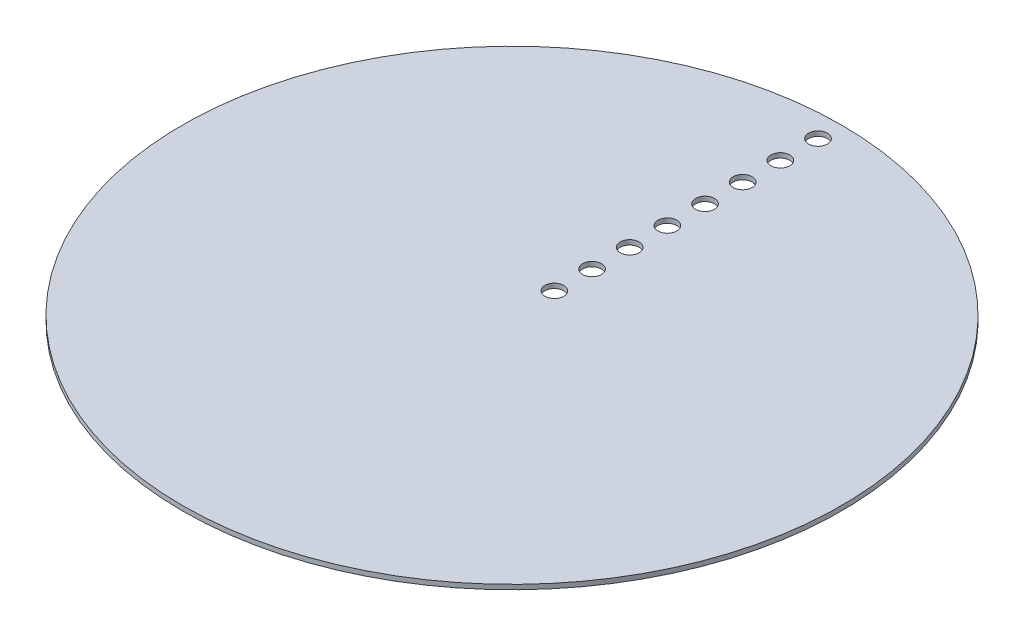
ISO-10303-21;
HEADER;
FILE_DESCRIPTION(('STEP AP214'),'2;1');
FILE_NAME('part.step','',(''),(''),'','','');
FILE_SCHEMA(('AUTOMOTIVE_DESIGN { 1 0 10303 214 1 1 1 1 }'));
ENDSEC;
DATA;
#1=APPLICATION_CONTEXT('core data for automotive mechanical design processes');
#2=APPLICATION_PROTOCOL_DEFINITION('international standard','automotive_design',2000,#1);
#3=PRODUCT_CONTEXT('',#1,'mechanical');
#4=PRODUCT('Part','Part','',(#3));
#5=PRODUCT_RELATED_PRODUCT_CATEGORY('part','',(#4));
#6=PRODUCT_DEFINITION_FORMATION('','',#4);
#7=PRODUCT_DEFINITION_CONTEXT('part definition',#1,'design');
#8=PRODUCT_DEFINITION('design','',#6,#7);
#9=PRODUCT_DEFINITION_SHAPE('','',#8);
#10=(LENGTH_UNIT() NAMED_UNIT(*) SI_UNIT(.MILLI.,.METRE.));
#11=(NAMED_UNIT(*) PLANE_ANGLE_UNIT() SI_UNIT($,.RADIAN.));
#12=(NAMED_UNIT(*) SI_UNIT($,.STERADIAN.) SOLID_ANGLE_UNIT());
#13=UNCERTAINTY_MEASURE_WITH_UNIT(LENGTH_MEASURE(1.E-05),#10,'distance_accuracy_value','');
#14=(GEOMETRIC_REPRESENTATION_CONTEXT(3) GLOBAL_UNCERTAINTY_ASSIGNED_CONTEXT((#13)) GLOBAL_UNIT_ASSIGNED_CONTEXT((#10,
#11,#12)) REPRESENTATION_CONTEXT('',''));
#15=CARTESIAN_POINT('',(0.,0.,0.));
#16=DIRECTION('',(0.,0.,1.));
#17=DIRECTION('',(1.,0.,0.));
#18=AXIS2_PLACEMENT_3D('',#15,#16,#17);
#19=CARTESIAN_POINT('',(0.,1.,0.));
#20=DIRECTION('',(0.,-1.,0.));
#21=DIRECTION('',(0.,0.,-1.));
#22=AXIS2_PLACEMENT_3D('',#19,#20,#21);
#23=CYLINDRICAL_SURFACE('',#22,70.);
#24=CARTESIAN_POINT('',(0.,1.,0.));
#25=DIRECTION('',(0.,1.,0.));
#26=DIRECTION('',(0.,0.,1.));
#27=AXIS2_PLACEMENT_3D('',#24,#25,#26);
#28=CIRCLE('',#27,70.);
#29=CARTESIAN_POINT('',(0.,1.,70.));
#30=VERTEX_POINT('',#29);
#31=EDGE_CURVE('E10',#30,#30,#28,.T.);
#32=ORIENTED_EDGE('',*,*,#31,.F.);
#33=EDGE_LOOP('',(#32));
#34=FACE_BOUND('',#33,.T.);
#35=CARTESIAN_POINT('',(0.,0.,0.));
#36=DIRECTION('',(0.,1.,0.));
#37=DIRECTION('',(0.,0.,1.));
#38=AXIS2_PLACEMENT_3D('',#35,#36,#37);
#39=CIRCLE('',#38,70.);
#40=CARTESIAN_POINT('',(0.,0.,70.));
#41=VERTEX_POINT('',#40);
#42=EDGE_CURVE('E44',#41,#41,#39,.T.);
#43=ORIENTED_EDGE('',*,*,#42,.T.);
#44=EDGE_LOOP('',(#43));
#45=FACE_BOUND('',#44,.T.);
#46=ADVANCED_FACE('F41',(#34,#45),#23,.T.);
#47=CARTESIAN_POINT('',(0.,1.,0.));
#48=DIRECTION('',(0.,1.,0.));
#49=DIRECTION('',(0.,0.,1.));
#50=AXIS2_PLACEMENT_3D('',#47,#48,#49);
#51=PLANE('',#50);
#52=CARTESIAN_POINT('',(0.,1.,-9.));
#53=DIRECTION('',(0.,1.,0.));
#54=DIRECTION('',(0.,0.,1.));
#55=AXIS2_PLACEMENT_3D('',#52,#53,#54);
#56=CIRCLE('',#55,2.);
#57=CARTESIAN_POINT('',(0.,1.,-7.));
#58=VERTEX_POINT('',#57);
#59=EDGE_CURVE('E95',#58,#58,#56,.T.);
#60=ORIENTED_EDGE('',*,*,#59,.F.);
#61=EDGE_LOOP('',(#60));
#62=FACE_BOUND('',#61,.T.);
#63=CARTESIAN_POINT('',(0.,1.,-17.));
#64=DIRECTION('',(0.,1.,0.));
#65=DIRECTION('',(0.,0.,1.));
#66=AXIS2_PLACEMENT_3D('',#63,#64,#65);
#67=CIRCLE('',#66,2.);
#68=CARTESIAN_POINT('',(0.,1.,-15.));
#69=VERTEX_POINT('',#68);
#70=EDGE_CURVE('E92',#69,#69,#67,.T.);
#71=ORIENTED_EDGE('',*,*,#70,.F.);
#72=EDGE_LOOP('',(#71));
#73=FACE_BOUND('',#72,.T.);
#74=CARTESIAN_POINT('',(0.,1.,-25.));
#75=DIRECTION('',(0.,1.,0.));
#76=DIRECTION('',(0.,0.,1.));
#77=AXIS2_PLACEMENT_3D('',#74,#75,#76);
#78=CIRCLE('',#77,2.);
#79=CARTESIAN_POINT('',(0.,1.,-23.));
#80=VERTEX_POINT('',#79);
#81=EDGE_CURVE('E86',#80,#80,#78,.T.);
#82=ORIENTED_EDGE('',*,*,#81,.F.);
#83=EDGE_LOOP('',(#82));
#84=FACE_BOUND('',#83,.T.);
#85=CARTESIAN_POINT('',(0.,1.,-33.));
#86=DIRECTION('',(0.,1.,0.));
#87=DIRECTION('',(0.,0.,1.));
#88=AXIS2_PLACEMENT_3D('',#85,#86,#87);
#89=CIRCLE('',#88,2.);
#90=CARTESIAN_POINT('',(0.,1.,-31.));
#91=VERTEX_POINT('',#90);
#92=EDGE_CURVE('E80',#91,#91,#89,.T.);
#93=ORIENTED_EDGE('',*,*,#92,.F.);
#94=EDGE_LOOP('',(#93));
#95=FACE_BOUND('',#94,.T.);
#96=CARTESIAN_POINT('',(0.,1.,-41.));
#97=DIRECTION('',(0.,1.,0.));
#98=DIRECTION('',(0.,0.,1.));
#99=AXIS2_PLACEMENT_3D('',#96,#97,#98);
#100=CIRCLE('',#99,2.);
#101=CARTESIAN_POINT('',(0.,1.,-39.));
#102=VERTEX_POINT('',#101);
#103=EDGE_CURVE('E74',#102,#102,#100,.T.);
#104=ORIENTED_EDGE('',*,*,#103,.F.);
#105=EDGE_LOOP('',(#104));
#106=FACE_BOUND('',#105,.T.);
#107=CARTESIAN_POINT('',(0.,1.,-49.));
#108=DIRECTION('',(0.,1.,0.));
#109=DIRECTION('',(0.,0.,1.));
#110=AXIS2_PLACEMENT_3D('',#107,#108,#109);
#111=CIRCLE('',#110,2.);
#112=CARTESIAN_POINT('',(0.,1.,-47.));
#113=VERTEX_POINT('',#112);
#114=EDGE_CURVE('E68',#113,#113,#111,.T.);
#115=ORIENTED_EDGE('',*,*,#114,.F.);
#116=EDGE_LOOP('',(#115));
#117=FACE_BOUND('',#116,.T.);
#118=CARTESIAN_POINT('',(0.,1.,-57.));
#119=DIRECTION('',(0.,1.,0.));
#120=DIRECTION('',(0.,0.,1.));
#121=AXIS2_PLACEMENT_3D('',#118,#119,#120);
#122=CIRCLE('',#121,2.);
#123=CARTESIAN_POINT('',(0.,1.,-55.));
#124=VERTEX_POINT('',#123);
#125=EDGE_CURVE('E62',#124,#124,#122,.T.);
#126=ORIENTED_EDGE('',*,*,#125,.F.);
#127=EDGE_LOOP('',(#126));
#128=FACE_BOUND('',#127,.T.);
#129=CARTESIAN_POINT('',(0.,1.,-65.));
#130=DIRECTION('',(0.,1.,0.));
#131=DIRECTION('',(0.,0.,1.));
#132=AXIS2_PLACEMENT_3D('',#129,#130,#131);
#133=CIRCLE('',#132,2.);
#134=CARTESIAN_POINT('',(0.,1.,-63.));
#135=VERTEX_POINT('',#134);
#136=EDGE_CURVE('E56',#135,#135,#133,.T.);
#137=ORIENTED_EDGE('',*,*,#136,.F.);
#138=EDGE_LOOP('',(#137));
#139=FACE_BOUND('',#138,.T.);
#140=ORIENTED_EDGE('',*,*,#31,.T.);
#141=EDGE_LOOP('',(#140));
#142=FACE_BOUND('',#141,.T.);
#143=ADVANCED_FACE('F111',(#62,#73,#84,#95,#106,#117,#128,#139,#142),#51,.T.);
#144=CARTESIAN_POINT('',(0.,0.,0.));
#145=DIRECTION('',(0.,1.,0.));
#146=DIRECTION('',(0.,0.,1.));
#147=AXIS2_PLACEMENT_3D('',#144,#145,#146);
#148=PLANE('',#147);
#149=CARTESIAN_POINT('',(0.,0.,-9.));
#150=DIRECTION('',(0.,1.,0.));
#151=DIRECTION('',(0.,0.,1.));
#152=AXIS2_PLACEMENT_3D('',#149,#150,#151);
#153=CIRCLE('',#152,2.);
#154=CARTESIAN_POINT('',(0.,0.,-7.));
#155=VERTEX_POINT('',#154);
#156=EDGE_CURVE('E51',#155,#155,#153,.T.);
#157=ORIENTED_EDGE('',*,*,#156,.T.);
#158=EDGE_LOOP('',(#157));
#159=FACE_BOUND('',#158,.T.);
#160=CARTESIAN_POINT('',(0.,0.,-17.));
#161=DIRECTION('',(0.,1.,0.));
#162=DIRECTION('',(0.,0.,1.));
#163=AXIS2_PLACEMENT_3D('',#160,#161,#162);
#164=CIRCLE('',#163,2.);
#165=CARTESIAN_POINT('',(0.,0.,-15.));
#166=VERTEX_POINT('',#165);
#167=EDGE_CURVE('E89',#166,#166,#164,.T.);
#168=ORIENTED_EDGE('',*,*,#167,.T.);
#169=EDGE_LOOP('',(#168));
#170=FACE_BOUND('',#169,.T.);
#171=CARTESIAN_POINT('',(0.,0.,-25.));
#172=DIRECTION('',(0.,1.,0.));
#173=DIRECTION('',(0.,0.,1.));
#174=AXIS2_PLACEMENT_3D('',#171,#172,#173);
#175=CIRCLE('',#174,2.);
#176=CARTESIAN_POINT('',(0.,0.,-23.));
#177=VERTEX_POINT('',#176);
#178=EDGE_CURVE('E83',#177,#177,#175,.T.);
#179=ORIENTED_EDGE('',*,*,#178,.T.);
#180=EDGE_LOOP('',(#179));
#181=FACE_BOUND('',#180,.T.);
#182=CARTESIAN_POINT('',(0.,0.,-33.));
#183=DIRECTION('',(0.,1.,0.));
#184=DIRECTION('',(0.,0.,1.));
#185=AXIS2_PLACEMENT_3D('',#182,#183,#184);
#186=CIRCLE('',#185,2.);
#187=CARTESIAN_POINT('',(0.,0.,-31.));
#188=VERTEX_POINT('',#187);
#189=EDGE_CURVE('E77',#188,#188,#186,.T.);
#190=ORIENTED_EDGE('',*,*,#189,.T.);
#191=EDGE_LOOP('',(#190));
#192=FACE_BOUND('',#191,.T.);
#193=CARTESIAN_POINT('',(0.,0.,-41.));
#194=DIRECTION('',(0.,1.,0.));
#195=DIRECTION('',(0.,0.,1.));
#196=AXIS2_PLACEMENT_3D('',#193,#194,#195);
#197=CIRCLE('',#196,2.);
#198=CARTESIAN_POINT('',(0.,0.,-39.));
#199=VERTEX_POINT('',#198);
#200=EDGE_CURVE('E71',#199,#199,#197,.T.);
#201=ORIENTED_EDGE('',*,*,#200,.T.);
#202=EDGE_LOOP('',(#201));
#203=FACE_BOUND('',#202,.T.);
#204=CARTESIAN_POINT('',(0.,0.,-49.));
#205=DIRECTION('',(0.,1.,0.));
#206=DIRECTION('',(0.,0.,1.));
#207=AXIS2_PLACEMENT_3D('',#204,#205,#206);
#208=CIRCLE('',#207,2.);
#209=CARTESIAN_POINT('',(0.,0.,-47.));
#210=VERTEX_POINT('',#209);
#211=EDGE_CURVE('E65',#210,#210,#208,.T.);
#212=ORIENTED_EDGE('',*,*,#211,.T.);
#213=EDGE_LOOP('',(#212));
#214=FACE_BOUND('',#213,.T.);
#215=CARTESIAN_POINT('',(0.,0.,-57.));
#216=DIRECTION('',(0.,1.,0.));
#217=DIRECTION('',(0.,0.,1.));
#218=AXIS2_PLACEMENT_3D('',#215,#216,#217);
#219=CIRCLE('',#218,2.);
#220=CARTESIAN_POINT('',(0.,0.,-55.));
#221=VERTEX_POINT('',#220);
#222=EDGE_CURVE('E59',#221,#221,#219,.T.);
#223=ORIENTED_EDGE('',*,*,#222,.T.);
#224=EDGE_LOOP('',(#223));
#225=FACE_BOUND('',#224,.T.);
#226=CARTESIAN_POINT('',(0.,0.,-65.));
#227=DIRECTION('',(0.,1.,0.));
#228=DIRECTION('',(0.,0.,1.));
#229=AXIS2_PLACEMENT_3D('',#226,#227,#228);
#230=CIRCLE('',#229,2.);
#231=CARTESIAN_POINT('',(0.,0.,-63.));
#232=VERTEX_POINT('',#231);
#233=EDGE_CURVE('E53',#232,#232,#230,.T.);
#234=ORIENTED_EDGE('',*,*,#233,.T.);
#235=EDGE_LOOP('',(#234));
#236=FACE_BOUND('',#235,.T.);
#237=ORIENTED_EDGE('',*,*,#42,.F.);
#238=EDGE_LOOP('',(#237));
#239=FACE_BOUND('',#238,.T.);
#240=ADVANCED_FACE('F101',(#159,#170,#181,#192,#203,#214,#225,#236,#239),#148,.F.);
#241=CARTESIAN_POINT('',(0.,0.,-65.));
#242=DIRECTION('',(0.,1.,0.));
#243=DIRECTION('',(0.,0.,1.));
#244=AXIS2_PLACEMENT_3D('',#241,#242,#243);
#245=CYLINDRICAL_SURFACE('',#244,2.);
#246=ORIENTED_EDGE('',*,*,#233,.F.);
#247=EDGE_LOOP('',(#246));
#248=FACE_BOUND('',#247,.T.);
#249=ORIENTED_EDGE('',*,*,#136,.T.);
#250=EDGE_LOOP('',(#249));
#251=FACE_BOUND('',#250,.T.);
#252=ADVANCED_FACE('F129',(#248,#251),#245,.F.);
#253=CARTESIAN_POINT('',(0.,0.,-57.));
#254=DIRECTION('',(0.,1.,0.));
#255=DIRECTION('',(0.,0.,1.));
#256=AXIS2_PLACEMENT_3D('',#253,#254,#255);
#257=CYLINDRICAL_SURFACE('',#256,2.);
#258=ORIENTED_EDGE('',*,*,#222,.F.);
#259=EDGE_LOOP('',(#258));
#260=FACE_BOUND('',#259,.T.);
#261=ORIENTED_EDGE('',*,*,#125,.T.);
#262=EDGE_LOOP('',(#261));
#263=FACE_BOUND('',#262,.T.);
#264=ADVANCED_FACE('F131',(#260,#263),#257,.F.);
#265=CARTESIAN_POINT('',(0.,0.,-49.));
#266=DIRECTION('',(0.,1.,0.));
#267=DIRECTION('',(0.,0.,1.));
#268=AXIS2_PLACEMENT_3D('',#265,#266,#267);
#269=CYLINDRICAL_SURFACE('',#268,2.);
#270=ORIENTED_EDGE('',*,*,#211,.F.);
#271=EDGE_LOOP('',(#270));
#272=FACE_BOUND('',#271,.T.);
#273=ORIENTED_EDGE('',*,*,#114,.T.);
#274=EDGE_LOOP('',(#273));
#275=FACE_BOUND('',#274,.T.);
#276=ADVANCED_FACE('F138',(#272,#275),#269,.F.);
#277=CARTESIAN_POINT('',(0.,0.,-41.));
#278=DIRECTION('',(0.,1.,0.));
#279=DIRECTION('',(0.,0.,1.));
#280=AXIS2_PLACEMENT_3D('',#277,#278,#279);
#281=CYLINDRICAL_SURFACE('',#280,2.);
#282=ORIENTED_EDGE('',*,*,#200,.F.);
#283=EDGE_LOOP('',(#282));
#284=FACE_BOUND('',#283,.T.);
#285=ORIENTED_EDGE('',*,*,#103,.T.);
#286=EDGE_LOOP('',(#285));
#287=FACE_BOUND('',#286,.T.);
#288=ADVANCED_FACE('F179',(#284,#287),#281,.F.);
#289=CARTESIAN_POINT('',(0.,0.,-33.));
#290=DIRECTION('',(0.,1.,0.));
#291=DIRECTION('',(0.,0.,1.));
#292=AXIS2_PLACEMENT_3D('',#289,#290,#291);
#293=CYLINDRICAL_SURFACE('',#292,2.);
#294=ORIENTED_EDGE('',*,*,#189,.F.);
#295=EDGE_LOOP('',(#294));
#296=FACE_BOUND('',#295,.T.);
#297=ORIENTED_EDGE('',*,*,#92,.T.);
#298=EDGE_LOOP('',(#297));
#299=FACE_BOUND('',#298,.T.);
#300=ADVANCED_FACE('F189',(#296,#299),#293,.F.);
#301=CARTESIAN_POINT('',(0.,0.,-25.));
#302=DIRECTION('',(0.,1.,0.));
#303=DIRECTION('',(0.,0.,1.));
#304=AXIS2_PLACEMENT_3D('',#301,#302,#303);
#305=CYLINDRICAL_SURFACE('',#304,2.);
#306=ORIENTED_EDGE('',*,*,#178,.F.);
#307=EDGE_LOOP('',(#306));
#308=FACE_BOUND('',#307,.T.);
#309=ORIENTED_EDGE('',*,*,#81,.T.);
#310=EDGE_LOOP('',(#309));
#311=FACE_BOUND('',#310,.T.);
#312=ADVANCED_FACE('F199',(#308,#311),#305,.F.);
#313=CARTESIAN_POINT('',(0.,0.,-17.));
#314=DIRECTION('',(0.,1.,0.));
#315=DIRECTION('',(0.,0.,1.));
#316=AXIS2_PLACEMENT_3D('',#313,#314,#315);
#317=CYLINDRICAL_SURFACE('',#316,2.);
#318=ORIENTED_EDGE('',*,*,#167,.F.);
#319=EDGE_LOOP('',(#318));
#320=FACE_BOUND('',#319,.T.);
#321=ORIENTED_EDGE('',*,*,#70,.T.);
#322=EDGE_LOOP('',(#321));
#323=FACE_BOUND('',#322,.T.);
#324=ADVANCED_FACE('F107',(#320,#323),#317,.F.);
#325=CARTESIAN_POINT('',(0.,0.,-9.));
#326=DIRECTION('',(0.,1.,0.));
#327=DIRECTION('',(0.,0.,1.));
#328=AXIS2_PLACEMENT_3D('',#325,#326,#327);
#329=CYLINDRICAL_SURFACE('',#328,2.);
#330=ORIENTED_EDGE('',*,*,#156,.F.);
#331=EDGE_LOOP('',(#330));
#332=FACE_BOUND('',#331,.T.);
#333=ORIENTED_EDGE('',*,*,#59,.T.);
#334=EDGE_LOOP('',(#333));
#335=FACE_BOUND('',#334,.T.);
#336=ADVANCED_FACE('F104',(#332,#335),#329,.F.);
#337=CLOSED_SHELL('',(#46,#143,#240,#252,#264,#276,#288,#300,#312,#324,#336));
#338=MANIFOLD_SOLID_BREP('B2',#337);
#339=ADVANCED_BREP_SHAPE_REPRESENTATION('',(#18,#338),#14);
#340=SHAPE_DEFINITION_REPRESENTATION(#9,#339);
ENDSEC;
END-ISO-10303-21;
